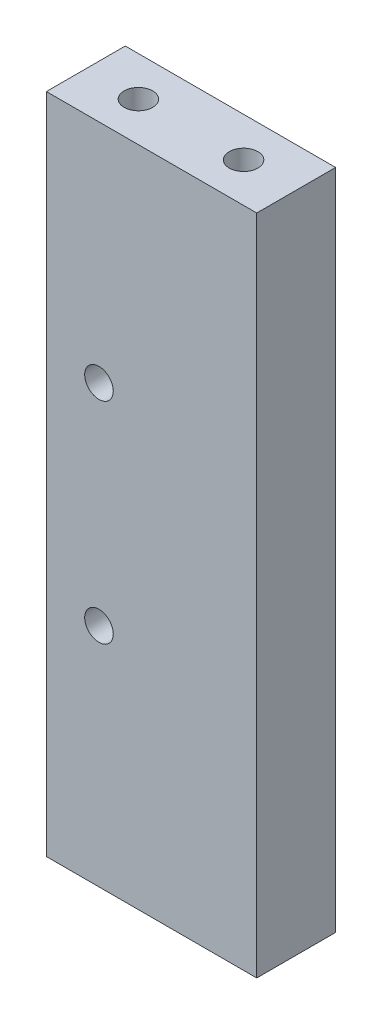
ISO-10303-21;
HEADER;
FILE_DESCRIPTION(('STEP AP214'),'2;1');
FILE_NAME('part.step','',(''),(''),'','','');
FILE_SCHEMA(('AUTOMOTIVE_DESIGN { 1 0 10303 214 1 1 1 1 }'));
ENDSEC;
DATA;
#1=APPLICATION_CONTEXT('core data for automotive mechanical design processes');
#2=APPLICATION_PROTOCOL_DEFINITION('international standard','automotive_design',2000,#1);
#3=PRODUCT_CONTEXT('',#1,'mechanical');
#4=PRODUCT('Part','Part','',(#3));
#5=PRODUCT_RELATED_PRODUCT_CATEGORY('part','',(#4));
#6=PRODUCT_DEFINITION_FORMATION('','',#4);
#7=PRODUCT_DEFINITION_CONTEXT('part definition',#1,'design');
#8=PRODUCT_DEFINITION('design','',#6,#7);
#9=PRODUCT_DEFINITION_SHAPE('','',#8);
#10=(LENGTH_UNIT() NAMED_UNIT(*) SI_UNIT(.MILLI.,.METRE.));
#11=(NAMED_UNIT(*) PLANE_ANGLE_UNIT() SI_UNIT($,.RADIAN.));
#12=(NAMED_UNIT(*) SI_UNIT($,.STERADIAN.) SOLID_ANGLE_UNIT());
#13=UNCERTAINTY_MEASURE_WITH_UNIT(LENGTH_MEASURE(1.E-05),#10,'distance_accuracy_value','');
#14=(GEOMETRIC_REPRESENTATION_CONTEXT(3) GLOBAL_UNCERTAINTY_ASSIGNED_CONTEXT((#13)) GLOBAL_UNIT_ASSIGNED_CONTEXT((#10,
#11,#12)) REPRESENTATION_CONTEXT('',''));
#15=CARTESIAN_POINT('',(0.,0.,0.));
#16=DIRECTION('',(0.,0.,1.));
#17=DIRECTION('',(1.,0.,0.));
#18=AXIS2_PLACEMENT_3D('',#15,#16,#17);
#19=CARTESIAN_POINT('',(-27.3388938416424,80.,-9.525));
#20=DIRECTION('',(1.,0.,0.));
#21=DIRECTION('',(0.,0.,-1.));
#22=AXIS2_PLACEMENT_3D('',#19,#20,#21);
#23=PLANE('',#22);
#24=DIRECTION('',(0.,0.,1.));
#25=VECTOR('',#24,1.);
#26=CARTESIAN_POINT('',(-27.3388938416424,0.,-9.525));
#27=LINE('',#26,#25);
#28=CARTESIAN_POINT('',(-27.3388938416424,0.,-9.525));
#29=VERTEX_POINT('',#28);
#30=CARTESIAN_POINT('',(-27.3388938416425,0.,0.));
#31=VERTEX_POINT('',#30);
#32=EDGE_CURVE('E132',#29,#31,#27,.T.);
#33=ORIENTED_EDGE('',*,*,#32,.T.);
#34=DIRECTION('',(0.,-1.,0.));
#35=VECTOR('',#34,1.);
#36=CARTESIAN_POINT('',(-27.3388938416425,80.,0.));
#37=LINE('',#36,#35);
#38=CARTESIAN_POINT('',(-27.3388938416425,80.,0.));
#39=VERTEX_POINT('',#38);
#40=EDGE_CURVE('E11',#39,#31,#37,.T.);
#41=ORIENTED_EDGE('',*,*,#40,.F.);
#42=DIRECTION('',(0.,0.,1.));
#43=VECTOR('',#42,1.);
#44=CARTESIAN_POINT('',(-27.3388938416424,80.,-9.525));
#45=LINE('',#44,#43);
#46=CARTESIAN_POINT('',(-27.3388938416424,80.,-9.525));
#47=VERTEX_POINT('',#46);
#48=EDGE_CURVE('E133',#47,#39,#45,.T.);
#49=ORIENTED_EDGE('',*,*,#48,.F.);
#50=DIRECTION('',(0.,-1.,0.));
#51=VECTOR('',#50,1.);
#52=CARTESIAN_POINT('',(-27.3388938416424,80.,-9.525));
#53=LINE('',#52,#51);
#54=EDGE_CURVE('E139',#47,#29,#53,.T.);
#55=ORIENTED_EDGE('',*,*,#54,.T.);
#56=EDGE_LOOP('',(#33,#41,#49,#55));
#57=FACE_BOUND('',#56,.T.);
#58=ADVANCED_FACE('F37',(#57),#23,.F.);
#59=CARTESIAN_POINT('',(-27.3388938416425,80.,0.));
#60=DIRECTION('',(0.,0.,-1.));
#61=DIRECTION('',(-1.,0.,0.));
#62=AXIS2_PLACEMENT_3D('',#59,#60,#61);
#63=PLANE('',#62);
#64=CARTESIAN_POINT('',(-20.9888938416425,52.705,0.));
#65=DIRECTION('',(0.,0.,1.));
#66=DIRECTION('',(1.,0.,0.));
#67=AXIS2_PLACEMENT_3D('',#64,#65,#66);
#68=CIRCLE('',#67,1.72719999999999);
#69=CARTESIAN_POINT('',(-19.2616938416425,52.705,0.));
#70=VERTEX_POINT('',#69);
#71=EDGE_CURVE('E182',#70,#70,#68,.T.);
#72=ORIENTED_EDGE('',*,*,#71,.F.);
#73=EDGE_LOOP('',(#72));
#74=FACE_BOUND('',#73,.T.);
#75=CARTESIAN_POINT('',(-20.9888938416425,27.305,0.));
#76=DIRECTION('',(0.,0.,1.));
#77=DIRECTION('',(1.,0.,0.));
#78=AXIS2_PLACEMENT_3D('',#75,#76,#77);
#79=CIRCLE('',#78,1.72719999999999);
#80=CARTESIAN_POINT('',(-19.2616938416425,27.305,0.));
#81=VERTEX_POINT('',#80);
#82=EDGE_CURVE('E185',#81,#81,#79,.T.);
#83=ORIENTED_EDGE('',*,*,#82,.F.);
#84=EDGE_LOOP('',(#83));
#85=FACE_BOUND('',#84,.T.);
#86=DIRECTION('',(1.,0.,0.));
#87=VECTOR('',#86,1.);
#88=CARTESIAN_POINT('',(-27.3388938416425,0.,0.));
#89=LINE('',#88,#87);
#90=CARTESIAN_POINT('',(-1.93889384164245,0.,0.));
#91=VERTEX_POINT('',#90);
#92=EDGE_CURVE('E142',#31,#91,#89,.T.);
#93=ORIENTED_EDGE('',*,*,#92,.T.);
#94=DIRECTION('',(0.,-1.,0.));
#95=VECTOR('',#94,1.);
#96=CARTESIAN_POINT('',(-1.93889384164245,80.,0.));
#97=LINE('',#96,#95);
#98=CARTESIAN_POINT('',(-1.93889384164245,80.,0.));
#99=VERTEX_POINT('',#98);
#100=EDGE_CURVE('E45',#99,#91,#97,.T.);
#101=ORIENTED_EDGE('',*,*,#100,.F.);
#102=DIRECTION('',(1.,0.,0.));
#103=VECTOR('',#102,1.);
#104=CARTESIAN_POINT('',(-27.3388938416425,80.,0.));
#105=LINE('',#104,#103);
#106=EDGE_CURVE('E84',#39,#99,#105,.T.);
#107=ORIENTED_EDGE('',*,*,#106,.F.);
#108=ORIENTED_EDGE('',*,*,#40,.T.);
#109=EDGE_LOOP('',(#93,#101,#107,#108));
#110=FACE_BOUND('',#109,.T.);
#111=ADVANCED_FACE('F167',(#74,#85,#110),#63,.F.);
#112=CARTESIAN_POINT('',(-1.93889384164245,80.,-9.525));
#113=DIRECTION('',(-1.,0.,0.));
#114=DIRECTION('',(0.,0.,1.));
#115=AXIS2_PLACEMENT_3D('',#112,#113,#114);
#116=PLANE('',#115);
#117=DIRECTION('',(0.,0.,-1.));
#118=VECTOR('',#117,1.);
#119=CARTESIAN_POINT('',(-1.93889384164245,0.,-9.525));
#120=LINE('',#119,#118);
#121=CARTESIAN_POINT('',(-1.93889384164245,0.,-9.525));
#122=VERTEX_POINT('',#121);
#123=EDGE_CURVE('E71',#91,#122,#120,.T.);
#124=ORIENTED_EDGE('',*,*,#123,.T.);
#125=DIRECTION('',(0.,-1.,0.));
#126=VECTOR('',#125,1.);
#127=CARTESIAN_POINT('',(-1.93889384164245,80.,-9.525));
#128=LINE('',#127,#126);
#129=CARTESIAN_POINT('',(-1.93889384164245,80.,-9.525));
#130=VERTEX_POINT('',#129);
#131=EDGE_CURVE('E147',#130,#122,#128,.T.);
#132=ORIENTED_EDGE('',*,*,#131,.F.);
#133=DIRECTION('',(0.,0.,-1.));
#134=VECTOR('',#133,1.);
#135=CARTESIAN_POINT('',(-1.93889384164245,80.,-9.525));
#136=LINE('',#135,#134);
#137=EDGE_CURVE('E136',#99,#130,#136,.T.);
#138=ORIENTED_EDGE('',*,*,#137,.F.);
#139=ORIENTED_EDGE('',*,*,#100,.T.);
#140=EDGE_LOOP('',(#124,#132,#138,#139));
#141=FACE_BOUND('',#140,.T.);
#142=ADVANCED_FACE('F149',(#141),#116,.F.);
#143=CARTESIAN_POINT('',(-27.3388938416424,80.,-9.525));
#144=DIRECTION('',(0.,0.,1.));
#145=DIRECTION('',(1.,0.,0.));
#146=AXIS2_PLACEMENT_3D('',#143,#144,#145);
#147=PLANE('',#146);
#148=CARTESIAN_POINT('',(-20.9888938416425,52.705,-9.525));
#149=DIRECTION('',(0.,0.,1.));
#150=DIRECTION('',(1.,0.,0.));
#151=AXIS2_PLACEMENT_3D('',#148,#149,#150);
#152=CIRCLE('',#151,1.7272);
#153=CARTESIAN_POINT('',(-19.2616938416425,52.705,-9.525));
#154=VERTEX_POINT('',#153);
#155=EDGE_CURVE('E187',#154,#154,#152,.T.);
#156=ORIENTED_EDGE('',*,*,#155,.T.);
#157=EDGE_LOOP('',(#156));
#158=FACE_BOUND('',#157,.T.);
#159=CARTESIAN_POINT('',(-20.9888938416425,27.305,-9.525));
#160=DIRECTION('',(0.,0.,1.));
#161=DIRECTION('',(1.,0.,0.));
#162=AXIS2_PLACEMENT_3D('',#159,#160,#161);
#163=CIRCLE('',#162,1.7272);
#164=CARTESIAN_POINT('',(-19.2616938416425,27.305,-9.525));
#165=VERTEX_POINT('',#164);
#166=EDGE_CURVE('E114',#165,#165,#163,.T.);
#167=ORIENTED_EDGE('',*,*,#166,.T.);
#168=EDGE_LOOP('',(#167));
#169=FACE_BOUND('',#168,.T.);
#170=DIRECTION('',(-1.,0.,0.));
#171=VECTOR('',#170,1.);
#172=CARTESIAN_POINT('',(-27.3388938416424,0.,-9.525));
#173=LINE('',#172,#171);
#174=EDGE_CURVE('E77',#122,#29,#173,.T.);
#175=ORIENTED_EDGE('',*,*,#174,.T.);
#176=ORIENTED_EDGE('',*,*,#54,.F.);
#177=DIRECTION('',(-1.,0.,0.));
#178=VECTOR('',#177,1.);
#179=CARTESIAN_POINT('',(-27.3388938416424,80.,-9.525));
#180=LINE('',#179,#178);
#181=EDGE_CURVE('E53',#130,#47,#180,.T.);
#182=ORIENTED_EDGE('',*,*,#181,.F.);
#183=ORIENTED_EDGE('',*,*,#131,.T.);
#184=EDGE_LOOP('',(#175,#176,#182,#183));
#185=FACE_BOUND('',#184,.T.);
#186=ADVANCED_FACE('F156',(#158,#169,#185),#147,.F.);
#187=CARTESIAN_POINT('',(0.,80.,0.));
#188=DIRECTION('',(0.,1.,0.));
#189=DIRECTION('',(0.,0.,1.));
#190=AXIS2_PLACEMENT_3D('',#187,#188,#189);
#191=PLANE('',#190);
#192=CARTESIAN_POINT('',(-8.28889384164245,80.,-4.7625));
#193=DIRECTION('',(0.,1.,0.));
#194=DIRECTION('',(0.,0.,1.));
#195=AXIS2_PLACEMENT_3D('',#192,#193,#194);
#196=CIRCLE('',#195,1.72719999999999);
#197=CARTESIAN_POINT('',(-8.28889384164245,80.,-3.03530000000001));
#198=VERTEX_POINT('',#197);
#199=EDGE_CURVE('E120',#198,#198,#196,.T.);
#200=ORIENTED_EDGE('',*,*,#199,.F.);
#201=EDGE_LOOP('',(#200));
#202=FACE_BOUND('',#201,.T.);
#203=CARTESIAN_POINT('',(-20.9888938416425,80.,-4.7625));
#204=DIRECTION('',(0.,1.,0.));
#205=DIRECTION('',(0.,0.,1.));
#206=AXIS2_PLACEMENT_3D('',#203,#204,#205);
#207=CIRCLE('',#206,1.72719999999999);
#208=CARTESIAN_POINT('',(-20.9888938416425,80.,-3.03530000000001));
#209=VERTEX_POINT('',#208);
#210=EDGE_CURVE('E126',#209,#209,#207,.T.);
#211=ORIENTED_EDGE('',*,*,#210,.F.);
#212=EDGE_LOOP('',(#211));
#213=FACE_BOUND('',#212,.T.);
#214=ORIENTED_EDGE('',*,*,#48,.T.);
#215=ORIENTED_EDGE('',*,*,#106,.T.);
#216=ORIENTED_EDGE('',*,*,#137,.T.);
#217=ORIENTED_EDGE('',*,*,#181,.T.);
#218=EDGE_LOOP('',(#214,#215,#216,#217));
#219=FACE_BOUND('',#218,.T.);
#220=ADVANCED_FACE('F158',(#202,#213,#219),#191,.T.);
#221=CARTESIAN_POINT('',(0.,0.,0.));
#222=DIRECTION('',(0.,1.,0.));
#223=DIRECTION('',(0.,0.,1.));
#224=AXIS2_PLACEMENT_3D('',#221,#222,#223);
#225=PLANE('',#224);
#226=CARTESIAN_POINT('',(-20.9888938416425,0.,-4.7625));
#227=DIRECTION('',(0.,-1.,0.));
#228=DIRECTION('',(0.,0.,-1.));
#229=AXIS2_PLACEMENT_3D('',#226,#227,#228);
#230=CIRCLE('',#229,1.72719999999999);
#231=CARTESIAN_POINT('',(-20.9888938416425,0.,-6.48969999999999));
#232=VERTEX_POINT('',#231);
#233=EDGE_CURVE('E108',#232,#232,#230,.T.);
#234=ORIENTED_EDGE('',*,*,#233,.F.);
#235=EDGE_LOOP('',(#234));
#236=FACE_BOUND('',#235,.T.);
#237=CARTESIAN_POINT('',(-8.28889384164245,0.,-4.7625));
#238=DIRECTION('',(0.,-1.,0.));
#239=DIRECTION('',(0.,0.,-1.));
#240=AXIS2_PLACEMENT_3D('',#237,#238,#239);
#241=CIRCLE('',#240,1.72719999999999);
#242=CARTESIAN_POINT('',(-8.28889384164245,0.,-6.48969999999999));
#243=VERTEX_POINT('',#242);
#244=EDGE_CURVE('E107',#243,#243,#241,.T.);
#245=ORIENTED_EDGE('',*,*,#244,.F.);
#246=EDGE_LOOP('',(#245));
#247=FACE_BOUND('',#246,.T.);
#248=ORIENTED_EDGE('',*,*,#32,.F.);
#249=ORIENTED_EDGE('',*,*,#174,.F.);
#250=ORIENTED_EDGE('',*,*,#123,.F.);
#251=ORIENTED_EDGE('',*,*,#92,.F.);
#252=EDGE_LOOP('',(#248,#249,#250,#251));
#253=FACE_BOUND('',#252,.T.);
#254=ADVANCED_FACE('F152',(#236,#247,#253),#225,.F.);
#255=CARTESIAN_POINT('',(-20.9888938416425,60.95,-4.7625));
#256=DIRECTION('',(0.,1.,0.));
#257=DIRECTION('',(0.,0.,1.));
#258=AXIS2_PLACEMENT_3D('',#255,#256,#257);
#259=CONICAL_SURFACE('',#258,1.72719999999999,1.02974425867665);
#260=CARTESIAN_POINT('',(-20.9888938416425,59.9121935388156,-4.7625));
#261=VERTEX_POINT('',#260);
#262=VERTEX_LOOP('',#261);
#263=FACE_BOUND('',#262,.T.);
#264=CARTESIAN_POINT('',(-20.9888938416425,60.95,-4.7625));
#265=DIRECTION('',(0.,1.,0.));
#266=DIRECTION('',(0.,0.,1.));
#267=AXIS2_PLACEMENT_3D('',#264,#265,#266);
#268=CIRCLE('',#267,1.72719999999999);
#269=CARTESIAN_POINT('',(-20.9888938416425,60.95,-3.03530000000001));
#270=VERTEX_POINT('',#269);
#271=EDGE_CURVE('E129',#270,#270,#268,.T.);
#272=ORIENTED_EDGE('',*,*,#271,.T.);
#273=EDGE_LOOP('',(#272));
#274=FACE_BOUND('',#273,.T.);
#275=ADVANCED_FACE('F225',(#263,#274),#259,.F.);
#276=CARTESIAN_POINT('',(-20.9888938416425,80.,-4.7625));
#277=DIRECTION('',(0.,1.,0.));
#278=DIRECTION('',(0.,0.,1.));
#279=AXIS2_PLACEMENT_3D('',#276,#277,#278);
#280=CYLINDRICAL_SURFACE('',#279,1.72719999999999);
#281=ORIENTED_EDGE('',*,*,#271,.F.);
#282=EDGE_LOOP('',(#281));
#283=FACE_BOUND('',#282,.T.);
#284=ORIENTED_EDGE('',*,*,#210,.T.);
#285=EDGE_LOOP('',(#284));
#286=FACE_BOUND('',#285,.T.);
#287=ADVANCED_FACE('F221',(#283,#286),#280,.F.);
#288=CARTESIAN_POINT('',(-8.28889384164245,60.95,-4.7625));
#289=DIRECTION('',(0.,1.,0.));
#290=DIRECTION('',(0.,0.,1.));
#291=AXIS2_PLACEMENT_3D('',#288,#289,#290);
#292=CONICAL_SURFACE('',#291,1.7272,1.02974425867665);
#293=CARTESIAN_POINT('',(-8.28889384164246,59.9121935388156,-4.7625));
#294=VERTEX_POINT('',#293);
#295=VERTEX_LOOP('',#294);
#296=FACE_BOUND('',#295,.T.);
#297=CARTESIAN_POINT('',(-8.28889384164245,60.95,-4.7625));
#298=DIRECTION('',(0.,1.,0.));
#299=DIRECTION('',(0.,0.,1.));
#300=AXIS2_PLACEMENT_3D('',#297,#298,#299);
#301=CIRCLE('',#300,1.7272);
#302=CARTESIAN_POINT('',(-8.28889384164245,60.95,-3.0353));
#303=VERTEX_POINT('',#302);
#304=EDGE_CURVE('E123',#303,#303,#301,.T.);
#305=ORIENTED_EDGE('',*,*,#304,.T.);
#306=EDGE_LOOP('',(#305));
#307=FACE_BOUND('',#306,.T.);
#308=ADVANCED_FACE('F217',(#296,#307),#292,.F.);
#309=CARTESIAN_POINT('',(-8.28889384164245,80.,-4.7625));
#310=DIRECTION('',(0.,1.,0.));
#311=DIRECTION('',(0.,0.,1.));
#312=AXIS2_PLACEMENT_3D('',#309,#310,#311);
#313=CYLINDRICAL_SURFACE('',#312,1.72719999999999);
#314=ORIENTED_EDGE('',*,*,#304,.F.);
#315=EDGE_LOOP('',(#314));
#316=FACE_BOUND('',#315,.T.);
#317=ORIENTED_EDGE('',*,*,#199,.T.);
#318=EDGE_LOOP('',(#317));
#319=FACE_BOUND('',#318,.T.);
#320=ADVANCED_FACE('F213',(#316,#319),#313,.F.);
#321=CARTESIAN_POINT('',(-8.28889384164245,20.066,-4.7625));
#322=DIRECTION('',(0.,-1.,0.));
#323=DIRECTION('',(0.,0.,-1.));
#324=AXIS2_PLACEMENT_3D('',#321,#322,#323);
#325=CONICAL_SURFACE('',#324,1.72719999999999,1.02974425867665);
#326=CARTESIAN_POINT('',(-8.28889384164246,21.1038064611844,-4.7625));
#327=VERTEX_POINT('',#326);
#328=VERTEX_LOOP('',#327);
#329=FACE_BOUND('',#328,.T.);
#330=CARTESIAN_POINT('',(-8.28889384164245,20.066,-4.7625));
#331=DIRECTION('',(0.,-1.,0.));
#332=DIRECTION('',(0.,0.,-1.));
#333=AXIS2_PLACEMENT_3D('',#330,#331,#332);
#334=CIRCLE('',#333,1.72719999999999);
#335=CARTESIAN_POINT('',(-8.28889384164245,20.066,-6.48969999999999));
#336=VERTEX_POINT('',#335);
#337=EDGE_CURVE('E111',#336,#336,#334,.T.);
#338=ORIENTED_EDGE('',*,*,#337,.T.);
#339=EDGE_LOOP('',(#338));
#340=FACE_BOUND('',#339,.T.);
#341=ADVANCED_FACE('F209',(#329,#340),#325,.F.);
#342=CARTESIAN_POINT('',(-8.28889384164245,0.,-4.7625));
#343=DIRECTION('',(0.,-1.,0.));
#344=DIRECTION('',(0.,0.,-1.));
#345=AXIS2_PLACEMENT_3D('',#342,#343,#344);
#346=CYLINDRICAL_SURFACE('',#345,1.72719999999999);
#347=ORIENTED_EDGE('',*,*,#337,.F.);
#348=EDGE_LOOP('',(#347));
#349=FACE_BOUND('',#348,.T.);
#350=ORIENTED_EDGE('',*,*,#244,.T.);
#351=EDGE_LOOP('',(#350));
#352=FACE_BOUND('',#351,.T.);
#353=ADVANCED_FACE('F101',(#349,#352),#346,.F.);
#354=CARTESIAN_POINT('',(-20.9888938416425,20.066,-4.7625));
#355=DIRECTION('',(0.,-1.,0.));
#356=DIRECTION('',(0.,0.,-1.));
#357=AXIS2_PLACEMENT_3D('',#354,#355,#356);
#358=CONICAL_SURFACE('',#357,1.72719999999999,1.02974425867665);
#359=CARTESIAN_POINT('',(-20.9888938416425,21.1038064611844,-4.7625));
#360=VERTEX_POINT('',#359);
#361=VERTEX_LOOP('',#360);
#362=FACE_BOUND('',#361,.T.);
#363=CARTESIAN_POINT('',(-20.9888938416425,20.066,-4.7625));
#364=DIRECTION('',(0.,-1.,0.));
#365=DIRECTION('',(0.,0.,-1.));
#366=AXIS2_PLACEMENT_3D('',#363,#364,#365);
#367=CIRCLE('',#366,1.72719999999999);
#368=CARTESIAN_POINT('',(-20.9888938416425,20.066,-6.48969999999999));
#369=VERTEX_POINT('',#368);
#370=EDGE_CURVE('E105',#369,#369,#367,.T.);
#371=ORIENTED_EDGE('',*,*,#370,.T.);
#372=EDGE_LOOP('',(#371));
#373=FACE_BOUND('',#372,.T.);
#374=ADVANCED_FACE('F97',(#362,#373),#358,.F.);
#375=CARTESIAN_POINT('',(-20.9888938416425,0.,-4.7625));
#376=DIRECTION('',(0.,-1.,0.));
#377=DIRECTION('',(0.,0.,-1.));
#378=AXIS2_PLACEMENT_3D('',#375,#376,#377);
#379=CYLINDRICAL_SURFACE('',#378,1.72719999999999);
#380=ORIENTED_EDGE('',*,*,#370,.F.);
#381=EDGE_LOOP('',(#380));
#382=FACE_BOUND('',#381,.T.);
#383=ORIENTED_EDGE('',*,*,#233,.T.);
#384=EDGE_LOOP('',(#383));
#385=FACE_BOUND('',#384,.T.);
#386=ADVANCED_FACE('F100',(#382,#385),#379,.F.);
#387=CARTESIAN_POINT('',(-20.9888938416425,27.305,0.));
#388=DIRECTION('',(0.,0.,1.));
#389=DIRECTION('',(1.,0.,0.));
#390=AXIS2_PLACEMENT_3D('',#387,#388,#389);
#391=CYLINDRICAL_SURFACE('',#390,1.72719999999999);
#392=ORIENTED_EDGE('',*,*,#166,.F.);
#393=EDGE_LOOP('',(#392));
#394=FACE_BOUND('',#393,.T.);
#395=ORIENTED_EDGE('',*,*,#82,.T.);
#396=EDGE_LOOP('',(#395));
#397=FACE_BOUND('',#396,.T.);
#398=ADVANCED_FACE('F195',(#394,#397),#391,.F.);
#399=CARTESIAN_POINT('',(-20.9888938416425,52.705,0.));
#400=DIRECTION('',(0.,0.,1.));
#401=DIRECTION('',(1.,0.,0.));
#402=AXIS2_PLACEMENT_3D('',#399,#400,#401);
#403=CYLINDRICAL_SURFACE('',#402,1.72719999999999);
#404=ORIENTED_EDGE('',*,*,#155,.F.);
#405=EDGE_LOOP('',(#404));
#406=FACE_BOUND('',#405,.T.);
#407=ORIENTED_EDGE('',*,*,#71,.T.);
#408=EDGE_LOOP('',(#407));
#409=FACE_BOUND('',#408,.T.);
#410=ADVANCED_FACE('F193',(#406,#409),#403,.F.);
#411=CLOSED_SHELL('',(#58,#111,#142,#186,#220,#254,#275,#287,#308,#320,#341,#353,#374,#386,#398,#410));
#412=MANIFOLD_SOLID_BREP('B2',#411);
#413=ADVANCED_BREP_SHAPE_REPRESENTATION('',(#18,#412),#14);
#414=SHAPE_DEFINITION_REPRESENTATION(#9,#413);
ENDSEC;
END-ISO-10303-21;
